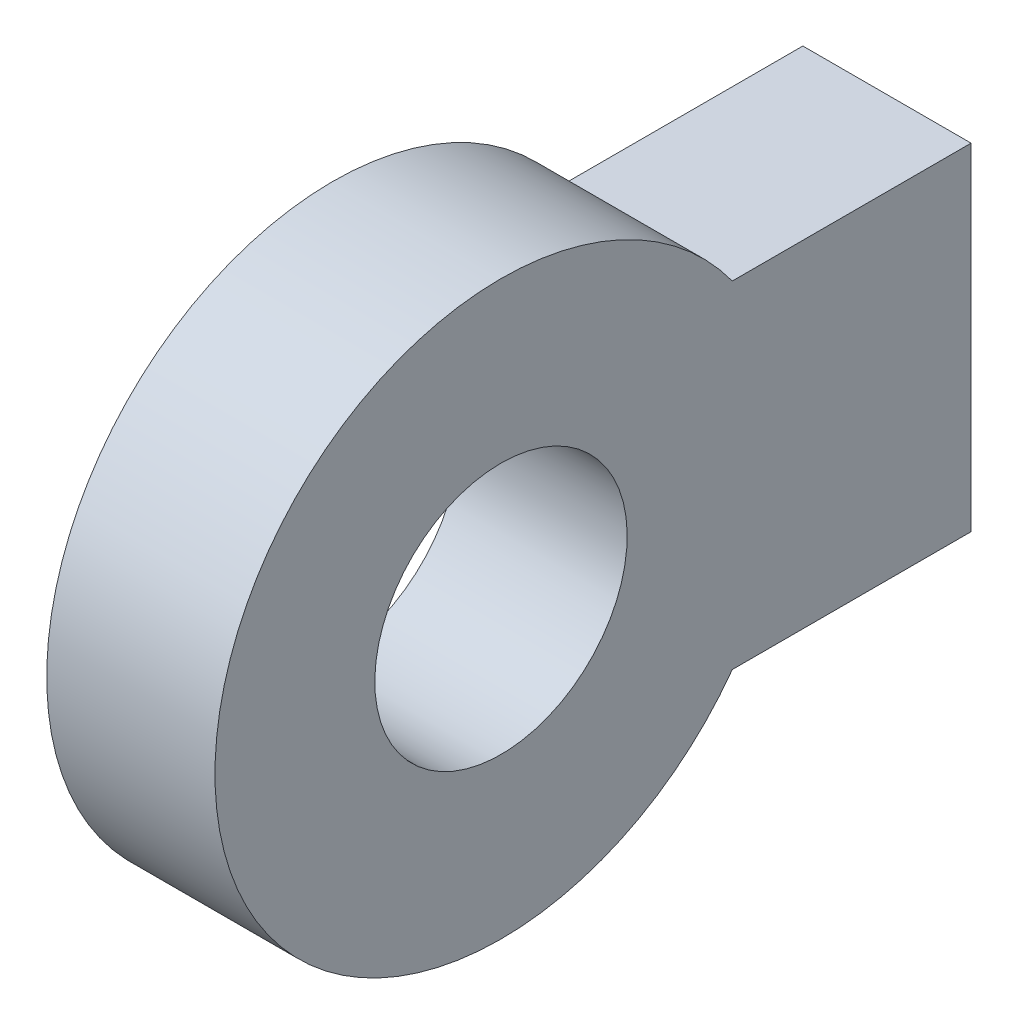
ISO-10303-21;
HEADER;
FILE_DESCRIPTION(('STEP AP214'),'2;1');
FILE_NAME('part.step','',(''),(''),'','','');
FILE_SCHEMA(('AUTOMOTIVE_DESIGN { 1 0 10303 214 1 1 1 1 }'));
ENDSEC;
DATA;
#1=APPLICATION_CONTEXT('core data for automotive mechanical design processes');
#2=APPLICATION_PROTOCOL_DEFINITION('international standard','automotive_design',2000,#1);
#3=PRODUCT_CONTEXT('',#1,'mechanical');
#4=PRODUCT('Part','Part','',(#3));
#5=PRODUCT_RELATED_PRODUCT_CATEGORY('part','',(#4));
#6=PRODUCT_DEFINITION_FORMATION('','',#4);
#7=PRODUCT_DEFINITION_CONTEXT('part definition',#1,'design');
#8=PRODUCT_DEFINITION('design','',#6,#7);
#9=PRODUCT_DEFINITION_SHAPE('','',#8);
#10=(LENGTH_UNIT() NAMED_UNIT(*) SI_UNIT(.MILLI.,.METRE.));
#11=(NAMED_UNIT(*) PLANE_ANGLE_UNIT() SI_UNIT($,.RADIAN.));
#12=(NAMED_UNIT(*) SI_UNIT($,.STERADIAN.) SOLID_ANGLE_UNIT());
#13=UNCERTAINTY_MEASURE_WITH_UNIT(LENGTH_MEASURE(1.E-05),#10,'distance_accuracy_value','');
#14=(GEOMETRIC_REPRESENTATION_CONTEXT(3) GLOBAL_UNCERTAINTY_ASSIGNED_CONTEXT((#13)) GLOBAL_UNIT_ASSIGNED_CONTEXT((#10,
#11,#12)) REPRESENTATION_CONTEXT('',''));
#15=CARTESIAN_POINT('',(0.,0.,0.));
#16=DIRECTION('',(0.,0.,1.));
#17=DIRECTION('',(1.,0.,0.));
#18=AXIS2_PLACEMENT_3D('',#15,#16,#17);
#19=CARTESIAN_POINT('',(-5.,10.,347.46));
#20=DIRECTION('',(1.,0.,0.));
#21=DIRECTION('',(0.,1.,0.));
#22=AXIS2_PLACEMENT_3D('',#19,#20,#21);
#23=PLANE('',#22);
#24=DIRECTION('',(0.,0.,-1.));
#25=VECTOR('',#24,1.);
#26=CARTESIAN_POINT('',(-5.,-10.,347.46));
#27=LINE('',#26,#25);
#28=CARTESIAN_POINT('',(-5.,-10.,346.412272915133));
#29=VERTEX_POINT('',#28);
#30=CARTESIAN_POINT('',(-5.,-10.,332.22));
#31=VERTEX_POINT('',#30);
#32=EDGE_CURVE('E11',#29,#31,#27,.T.);
#33=ORIENTED_EDGE('',*,*,#32,.F.);
#34=CARTESIAN_POINT('',(-5.,0.,360.16));
#35=DIRECTION('',(1.,0.,0.));
#36=DIRECTION('',(0.,1.,0.));
#37=AXIS2_PLACEMENT_3D('',#34,#35,#36);
#38=CIRCLE('',#37,17.);
#39=CARTESIAN_POINT('',(-5.,10.,346.412272915133));
#40=VERTEX_POINT('',#39);
#41=EDGE_CURVE('E96',#29,#40,#38,.F.);
#42=ORIENTED_EDGE('',*,*,#41,.T.);
#43=DIRECTION('',(0.,0.,-1.));
#44=VECTOR('',#43,1.);
#45=CARTESIAN_POINT('',(-5.,10.,347.46));
#46=LINE('',#45,#44);
#47=CARTESIAN_POINT('',(-5.,10.,332.22));
#48=VERTEX_POINT('',#47);
#49=EDGE_CURVE('E91',#40,#48,#46,.T.);
#50=ORIENTED_EDGE('',*,*,#49,.T.);
#51=DIRECTION('',(0.,-1.,0.));
#52=VECTOR('',#51,1.);
#53=CARTESIAN_POINT('',(-5.,10.,332.22));
#54=LINE('',#53,#52);
#55=EDGE_CURVE('E86',#48,#31,#54,.T.);
#56=ORIENTED_EDGE('',*,*,#55,.T.);
#57=EDGE_LOOP('',(#33,#42,#50,#56));
#58=FACE_BOUND('',#57,.T.);
#59=CARTESIAN_POINT('',(-5.,0.,360.16));
#60=DIRECTION('',(1.,0.,0.));
#61=DIRECTION('',(0.,1.,0.));
#62=AXIS2_PLACEMENT_3D('',#59,#60,#61);
#63=CIRCLE('',#62,7.50000000000001);
#64=CARTESIAN_POINT('',(-5.00000000000001,7.50000000000001,360.16));
#65=VERTEX_POINT('',#64);
#66=EDGE_CURVE('E93',#65,#65,#63,.F.);
#67=ORIENTED_EDGE('',*,*,#66,.F.);
#68=EDGE_LOOP('',(#67));
#69=FACE_BOUND('',#68,.T.);
#70=ADVANCED_FACE('F41',(#58,#69),#23,.F.);
#71=CARTESIAN_POINT('',(-5.,-10.,347.46));
#72=DIRECTION('',(0.,1.,0.));
#73=DIRECTION('',(0.,0.,1.));
#74=AXIS2_PLACEMENT_3D('',#71,#72,#73);
#75=PLANE('',#74);
#76=DIRECTION('',(0.,0.,-1.));
#77=VECTOR('',#76,1.);
#78=CARTESIAN_POINT('',(5.,-10.,347.46));
#79=LINE('',#78,#77);
#80=CARTESIAN_POINT('',(5.,-10.,346.412272915133));
#81=VERTEX_POINT('',#80);
#82=CARTESIAN_POINT('',(5.,-10.,332.22));
#83=VERTEX_POINT('',#82);
#84=EDGE_CURVE('E48',#81,#83,#79,.T.);
#85=ORIENTED_EDGE('',*,*,#84,.F.);
#86=DIRECTION('',(1.,0.,0.));
#87=VECTOR('',#86,1.);
#88=CARTESIAN_POINT('',(-50.8412774787691,-10.,346.412272915133));
#89=LINE('',#88,#87);
#90=EDGE_CURVE('E54',#29,#81,#89,.T.);
#91=ORIENTED_EDGE('',*,*,#90,.F.);
#92=ORIENTED_EDGE('',*,*,#32,.T.);
#93=DIRECTION('',(1.,0.,0.));
#94=VECTOR('',#93,1.);
#95=CARTESIAN_POINT('',(-5.,-10.,332.22));
#96=LINE('',#95,#94);
#97=EDGE_CURVE('E76',#31,#83,#96,.T.);
#98=ORIENTED_EDGE('',*,*,#97,.T.);
#99=EDGE_LOOP('',(#85,#91,#92,#98));
#100=FACE_BOUND('',#99,.T.);
#101=ADVANCED_FACE('F75',(#100),#75,.F.);
#102=CARTESIAN_POINT('',(5.,-10.,347.46));
#103=DIRECTION('',(-1.,0.,0.));
#104=DIRECTION('',(0.,-1.,0.));
#105=AXIS2_PLACEMENT_3D('',#102,#103,#104);
#106=PLANE('',#105);
#107=CARTESIAN_POINT('',(5.,0.,360.16));
#108=DIRECTION('',(1.,0.,0.));
#109=DIRECTION('',(0.,1.,0.));
#110=AXIS2_PLACEMENT_3D('',#107,#108,#109);
#111=CIRCLE('',#110,17.);
#112=CARTESIAN_POINT('',(5.,10.,346.412272915133));
#113=VERTEX_POINT('',#112);
#114=EDGE_CURVE('E113',#113,#81,#111,.T.);
#115=ORIENTED_EDGE('',*,*,#114,.T.);
#116=ORIENTED_EDGE('',*,*,#84,.T.);
#117=DIRECTION('',(0.,1.,0.));
#118=VECTOR('',#117,1.);
#119=CARTESIAN_POINT('',(5.,-10.,332.22));
#120=LINE('',#119,#118);
#121=CARTESIAN_POINT('',(5.,10.,332.22));
#122=VERTEX_POINT('',#121);
#123=EDGE_CURVE('E88',#83,#122,#120,.T.);
#124=ORIENTED_EDGE('',*,*,#123,.T.);
#125=DIRECTION('',(0.,0.,-1.));
#126=VECTOR('',#125,1.);
#127=CARTESIAN_POINT('',(5.,10.,347.46));
#128=LINE('',#127,#126);
#129=EDGE_CURVE('E106',#113,#122,#128,.T.);
#130=ORIENTED_EDGE('',*,*,#129,.F.);
#131=EDGE_LOOP('',(#115,#116,#124,#130));
#132=FACE_BOUND('',#131,.T.);
#133=CARTESIAN_POINT('',(5.,0.,360.16));
#134=DIRECTION('',(1.,0.,0.));
#135=DIRECTION('',(0.,1.,0.));
#136=AXIS2_PLACEMENT_3D('',#133,#134,#135);
#137=CIRCLE('',#136,7.50000000000001);
#138=CARTESIAN_POINT('',(5.,7.50000000000001,360.16));
#139=VERTEX_POINT('',#138);
#140=EDGE_CURVE('E116',#139,#139,#137,.T.);
#141=ORIENTED_EDGE('',*,*,#140,.F.);
#142=EDGE_LOOP('',(#141));
#143=FACE_BOUND('',#142,.T.);
#144=ADVANCED_FACE('F109',(#132,#143),#106,.F.);
#145=CARTESIAN_POINT('',(5.,10.,347.46));
#146=DIRECTION('',(0.,-1.,0.));
#147=DIRECTION('',(0.,0.,-1.));
#148=AXIS2_PLACEMENT_3D('',#145,#146,#147);
#149=PLANE('',#148);
#150=ORIENTED_EDGE('',*,*,#49,.F.);
#151=DIRECTION('',(1.,0.,0.));
#152=VECTOR('',#151,1.);
#153=CARTESIAN_POINT('',(-50.8412774787691,9.99999999999999,346.412272915133));
#154=LINE('',#153,#152);
#155=EDGE_CURVE('E99',#40,#113,#154,.T.);
#156=ORIENTED_EDGE('',*,*,#155,.T.);
#157=ORIENTED_EDGE('',*,*,#129,.T.);
#158=DIRECTION('',(-1.,0.,0.));
#159=VECTOR('',#158,1.);
#160=CARTESIAN_POINT('',(5.,10.,332.22));
#161=LINE('',#160,#159);
#162=EDGE_CURVE('E103',#122,#48,#161,.T.);
#163=ORIENTED_EDGE('',*,*,#162,.T.);
#164=EDGE_LOOP('',(#150,#156,#157,#163));
#165=FACE_BOUND('',#164,.T.);
#166=ADVANCED_FACE('F123',(#165),#149,.F.);
#167=CARTESIAN_POINT('',(0.,0.,332.22));
#168=DIRECTION('',(0.,0.,1.));
#169=DIRECTION('',(1.,0.,0.));
#170=AXIS2_PLACEMENT_3D('',#167,#168,#169);
#171=PLANE('',#170);
#172=ORIENTED_EDGE('',*,*,#55,.F.);
#173=ORIENTED_EDGE('',*,*,#162,.F.);
#174=ORIENTED_EDGE('',*,*,#123,.F.);
#175=ORIENTED_EDGE('',*,*,#97,.F.);
#176=EDGE_LOOP('',(#172,#173,#174,#175));
#177=FACE_BOUND('',#176,.T.);
#178=ADVANCED_FACE('F84',(#177),#171,.F.);
#179=CARTESIAN_POINT('',(-50.8412774787691,0.,360.16));
#180=DIRECTION('',(1.,0.,0.));
#181=DIRECTION('',(0.,1.,0.));
#182=AXIS2_PLACEMENT_3D('',#179,#180,#181);
#183=CYLINDRICAL_SURFACE('',#182,7.50000000000001);
#184=ORIENTED_EDGE('',*,*,#66,.T.);
#185=EDGE_LOOP('',(#184));
#186=FACE_BOUND('',#185,.T.);
#187=ORIENTED_EDGE('',*,*,#140,.T.);
#188=EDGE_LOOP('',(#187));
#189=FACE_BOUND('',#188,.T.);
#190=ADVANCED_FACE('F131',(#186,#189),#183,.F.);
#191=CARTESIAN_POINT('',(-50.8412774787691,0.,360.16));
#192=DIRECTION('',(1.,0.,0.));
#193=DIRECTION('',(0.,1.,0.));
#194=AXIS2_PLACEMENT_3D('',#191,#192,#193);
#195=CYLINDRICAL_SURFACE('',#194,17.);
#196=ORIENTED_EDGE('',*,*,#41,.F.);
#197=ORIENTED_EDGE('',*,*,#90,.T.);
#198=ORIENTED_EDGE('',*,*,#114,.F.);
#199=ORIENTED_EDGE('',*,*,#155,.F.);
#200=EDGE_LOOP('',(#196,#197,#198,#199));
#201=FACE_BOUND('',#200,.T.);
#202=ADVANCED_FACE('F121',(#201),#195,.T.);
#203=CLOSED_SHELL('',(#70,#101,#144,#166,#178,#190,#202));
#204=MANIFOLD_SOLID_BREP('B2',#203);
#205=ADVANCED_BREP_SHAPE_REPRESENTATION('',(#18,#204),#14);
#206=SHAPE_DEFINITION_REPRESENTATION(#9,#205);
ENDSEC;
END-ISO-10303-21;
